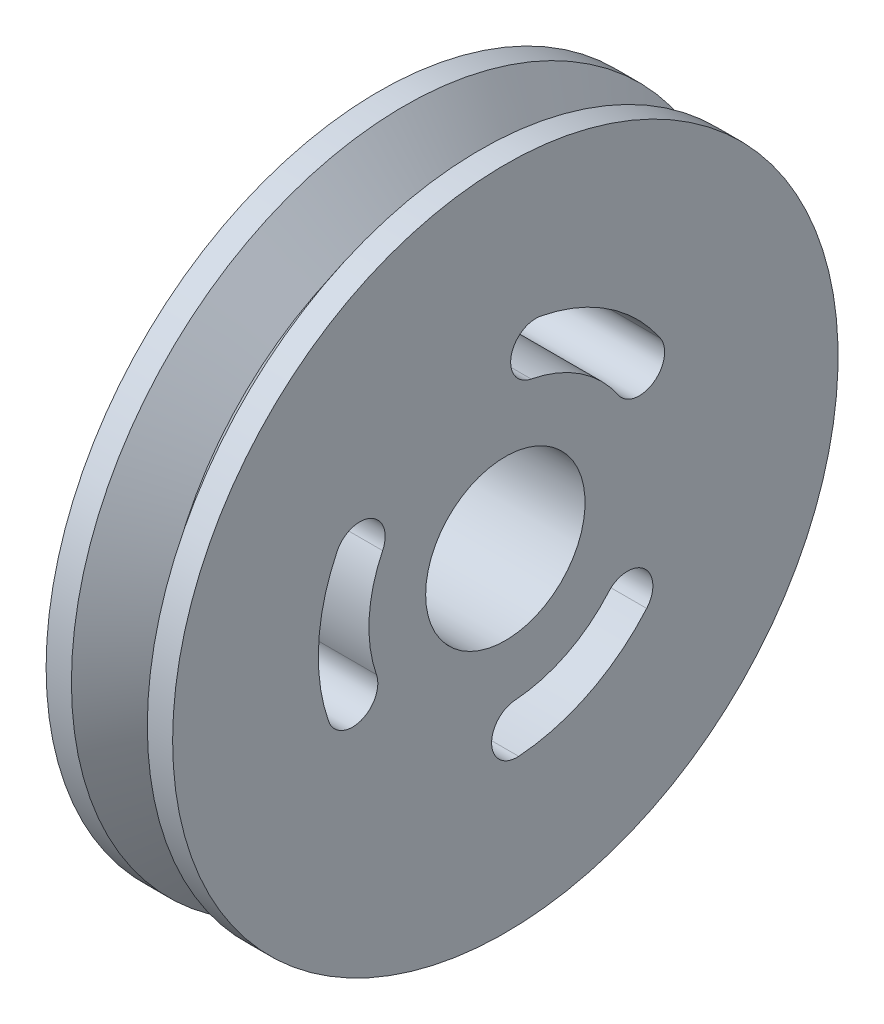
ISO-10303-21;
HEADER;
FILE_DESCRIPTION(('STEP AP214'),'2;1');
FILE_NAME('part.step','',(''),(''),'','','');
FILE_SCHEMA(('AUTOMOTIVE_DESIGN { 1 0 10303 214 1 1 1 1 }'));
ENDSEC;
DATA;
#1=APPLICATION_CONTEXT('core data for automotive mechanical design processes');
#2=APPLICATION_PROTOCOL_DEFINITION('international standard','automotive_design',2000,#1);
#3=PRODUCT_CONTEXT('',#1,'mechanical');
#4=PRODUCT('Part','Part','',(#3));
#5=PRODUCT_RELATED_PRODUCT_CATEGORY('part','',(#4));
#6=PRODUCT_DEFINITION_FORMATION('','',#4);
#7=PRODUCT_DEFINITION_CONTEXT('part definition',#1,'design');
#8=PRODUCT_DEFINITION('design','',#6,#7);
#9=PRODUCT_DEFINITION_SHAPE('','',#8);
#10=(LENGTH_UNIT() NAMED_UNIT(*) SI_UNIT(.MILLI.,.METRE.));
#11=(NAMED_UNIT(*) PLANE_ANGLE_UNIT() SI_UNIT($,.RADIAN.));
#12=(NAMED_UNIT(*) SI_UNIT($,.STERADIAN.) SOLID_ANGLE_UNIT());
#13=UNCERTAINTY_MEASURE_WITH_UNIT(LENGTH_MEASURE(1.E-05),#10,'distance_accuracy_value','');
#14=(GEOMETRIC_REPRESENTATION_CONTEXT(3) GLOBAL_UNCERTAINTY_ASSIGNED_CONTEXT((#13)) GLOBAL_UNIT_ASSIGNED_CONTEXT((#10,
#11,#12)) REPRESENTATION_CONTEXT('',''));
#15=CARTESIAN_POINT('',(0.,0.,0.));
#16=DIRECTION('',(0.,0.,1.));
#17=DIRECTION('',(1.,0.,0.));
#18=AXIS2_PLACEMENT_3D('',#15,#16,#17);
#19=CARTESIAN_POINT('',(0.,0.,0.));
#20=DIRECTION('',(-1.,0.,0.));
#21=DIRECTION('',(0.,0.,1.));
#22=AXIS2_PLACEMENT_3D('',#19,#20,#21);
#23=CYLINDRICAL_SURFACE('',#22,16.7);
#24=CARTESIAN_POINT('',(0.,0.,0.));
#25=DIRECTION('',(-1.,0.,0.));
#26=DIRECTION('',(0.,0.,1.));
#27=AXIS2_PLACEMENT_3D('',#24,#25,#26);
#28=CIRCLE('',#27,16.7);
#29=CARTESIAN_POINT('',(0.,0.,16.7));
#30=VERTEX_POINT('',#29);
#31=EDGE_CURVE('E11',#30,#30,#28,.T.);
#32=ORIENTED_EDGE('',*,*,#31,.F.);
#33=EDGE_LOOP('',(#32));
#34=FACE_BOUND('',#33,.T.);
#35=CARTESIAN_POINT('',(1.27,0.,0.));
#36=DIRECTION('',(-1.,0.,0.));
#37=DIRECTION('',(0.,0.,1.));
#38=AXIS2_PLACEMENT_3D('',#35,#36,#37);
#39=CIRCLE('',#38,16.7);
#40=CARTESIAN_POINT('',(1.27,0.,16.7));
#41=VERTEX_POINT('',#40);
#42=EDGE_CURVE('E239',#41,#41,#39,.T.);
#43=ORIENTED_EDGE('',*,*,#42,.T.);
#44=EDGE_LOOP('',(#43));
#45=FACE_BOUND('',#44,.T.);
#46=ADVANCED_FACE('F41',(#34,#45),#23,.T.);
#47=CARTESIAN_POINT('',(0.,4.,0.));
#48=DIRECTION('',(1.,0.,0.));
#49=DIRECTION('',(0.,0.,-1.));
#50=AXIS2_PLACEMENT_3D('',#47,#48,#49);
#51=PLANE('',#50);
#52=CARTESIAN_POINT('',(0.,-5.31594486441954,-6.13469558758409));
#53=DIRECTION('',(1.,0.,0.));
#54=DIRECTION('',(0.,0.,-1.));
#55=AXIS2_PLACEMENT_3D('',#52,#53,#54);
#56=CIRCLE('',#55,1.27);
#57=CARTESIAN_POINT('',(0.,-6.14763594661759,-7.09448199288072));
#58=VERTEX_POINT('',#57);
#59=CARTESIAN_POINT('',(0.,-4.48425378222147,-5.17490918228746));
#60=VERTEX_POINT('',#59);
#61=EDGE_CURVE('E230',#58,#60,#56,.T.);
#62=ORIENTED_EDGE('',*,*,#61,.T.);
#63=CARTESIAN_POINT('',(0.,-2.51914259051803E-10,-7.32369102869549E-10));
#64=DIRECTION('',(1.,0.,0.));
#65=DIRECTION('',(0.,0.,-1.));
#66=AXIS2_PLACEMENT_3D('',#63,#64,#65);
#67=CIRCLE('',#66,6.8474971355353);
#68=CARTESIAN_POINT('',(0.,-6.83005963277017,-0.488367116866568));
#69=VERTEX_POINT('',#68);
#70=EDGE_CURVE('E134',#60,#69,#67,.F.);
#71=ORIENTED_EDGE('',*,*,#70,.T.);
#72=CARTESIAN_POINT('',(0.,-8.09682551252071,-0.578944188467818));
#73=DIRECTION('',(1.,0.,0.));
#74=DIRECTION('',(0.,0.,-1.));
#75=AXIS2_PLACEMENT_3D('',#72,#73,#74);
#76=CIRCLE('',#75,1.27);
#77=CARTESIAN_POINT('',(0.,-9.36359139207367,-0.669521260054943));
#78=VERTEX_POINT('',#77);
#79=EDGE_CURVE('E235',#69,#78,#76,.T.);
#80=ORIENTED_EDGE('',*,*,#79,.T.);
#81=CARTESIAN_POINT('',(0.,-2.51914259051803E-10,-7.32369102869549E-10));
#82=DIRECTION('',(1.,0.,0.));
#83=DIRECTION('',(0.,0.,-1.));
#84=AXIS2_PLACEMENT_3D('',#81,#82,#83);
#85=CIRCLE('',#84,9.3874971355353);
#86=EDGE_CURVE('E232',#78,#58,#85,.T.);
#87=ORIENTED_EDGE('',*,*,#86,.T.);
#88=EDGE_LOOP('',(#62,#71,#80,#87));
#89=FACE_BOUND('',#88,.T.);
#90=CARTESIAN_POINT('',(0.,7.97077465452977,-1.53639550479309));
#91=DIRECTION('',(1.,0.,0.));
#92=DIRECTION('',(0.,0.,-1.));
#93=AXIS2_PLACEMENT_3D('',#90,#91,#92);
#94=CIRCLE('',#93,1.27);
#95=CARTESIAN_POINT('',(0.,9.21781960482263,-1.77676790742926));
#96=VERTEX_POINT('',#95);
#97=CARTESIAN_POINT('',(0.,6.72372970423691,-1.29602310215691));
#98=VERTEX_POINT('',#97);
#99=EDGE_CURVE('E218',#96,#98,#94,.T.);
#100=ORIENTED_EDGE('',*,*,#99,.T.);
#101=CARTESIAN_POINT('',(0.,-2.51914259051803E-10,-7.32369102869549E-10));
#102=DIRECTION('',(1.,0.,0.));
#103=DIRECTION('',(0.,0.,-1.));
#104=AXIS2_PLACEMENT_3D('',#101,#102,#103);
#105=CIRCLE('',#104,6.8474971355353);
#106=CARTESIAN_POINT('',(0.,3.83796814495237,-5.67082159378869));
#107=VERTEX_POINT('',#106);
#108=EDGE_CURVE('E227',#98,#107,#105,.F.);
#109=ORIENTED_EDGE('',*,*,#108,.T.);
#110=CARTESIAN_POINT('',(0.,4.54979312983473,-6.72258449049937));
#111=DIRECTION('',(1.,0.,0.));
#112=DIRECTION('',(0.,0.,-1.));
#113=AXIS2_PLACEMENT_3D('',#110,#111,#112);
#114=CIRCLE('',#113,1.27);
#115=CARTESIAN_POINT('',(0.,5.26161811460607,-7.77434738704602));
#116=VERTEX_POINT('',#115);
#117=EDGE_CURVE('E224',#107,#116,#114,.T.);
#118=ORIENTED_EDGE('',*,*,#117,.T.);
#119=CARTESIAN_POINT('',(0.,-2.51914259051803E-10,-7.32369102869549E-10));
#120=DIRECTION('',(1.,0.,0.));
#121=DIRECTION('',(0.,0.,-1.));
#122=AXIS2_PLACEMENT_3D('',#119,#120,#121);
#123=CIRCLE('',#122,9.38749713553531);
#124=EDGE_CURVE('E221',#116,#96,#123,.T.);
#125=ORIENTED_EDGE('',*,*,#124,.T.);
#126=EDGE_LOOP('',(#100,#109,#118,#125));
#127=FACE_BOUND('',#126,.T.);
#128=CARTESIAN_POINT('',(0.,-2.65482979086598,7.67109109018007));
#129=DIRECTION('',(1.,0.,0.));
#130=DIRECTION('',(0.,0.,-1.));
#131=AXIS2_PLACEMENT_3D('',#128,#129,#130);
#132=CIRCLE('',#131,1.27);
#133=CARTESIAN_POINT('',(0.,-3.07018365896078,8.87124989811287));
#134=VERTEX_POINT('',#133);
#135=CARTESIAN_POINT('',(0.,-2.23947592277117,6.47093228224726));
#136=VERTEX_POINT('',#135);
#137=EDGE_CURVE('E161',#134,#136,#132,.T.);
#138=ORIENTED_EDGE('',*,*,#137,.T.);
#139=CARTESIAN_POINT('',(0.,-2.51914259051803E-10,-7.32369102869549E-10));
#140=DIRECTION('',(1.,0.,0.));
#141=DIRECTION('',(0.,0.,-1.));
#142=AXIS2_PLACEMENT_3D('',#139,#140,#141);
#143=CIRCLE('',#142,6.8474971355353);
#144=CARTESIAN_POINT('',(0.,2.99209148706206,6.15918870845815));
#145=VERTEX_POINT('',#144);
#146=EDGE_CURVE('E215',#136,#145,#143,.F.);
#147=ORIENTED_EDGE('',*,*,#146,.T.);
#148=CARTESIAN_POINT('',(0.,3.54703238193023,7.30152867677008));
#149=DIRECTION('',(1.,0.,0.));
#150=DIRECTION('',(0.,0.,-1.));
#151=AXIS2_PLACEMENT_3D('',#148,#149,#150);
#152=CIRCLE('',#151,1.27);
#153=CARTESIAN_POINT('',(0.,4.10197327671187,8.44386864490385));
#154=VERTEX_POINT('',#153);
#155=EDGE_CURVE('E212',#145,#154,#152,.T.);
#156=ORIENTED_EDGE('',*,*,#155,.T.);
#157=CARTESIAN_POINT('',(0.,-2.51914259051803E-10,-7.32369102869549E-10));
#158=DIRECTION('',(1.,0.,0.));
#159=DIRECTION('',(0.,0.,-1.));
#160=AXIS2_PLACEMENT_3D('',#157,#158,#159);
#161=CIRCLE('',#160,9.3874971355353);
#162=EDGE_CURVE('E209',#154,#134,#161,.T.);
#163=ORIENTED_EDGE('',*,*,#162,.T.);
#164=EDGE_LOOP('',(#138,#147,#156,#163));
#165=FACE_BOUND('',#164,.T.);
#166=CARTESIAN_POINT('',(0.,0.,0.));
#167=DIRECTION('',(-1.,0.,0.));
#168=DIRECTION('',(0.,0.,1.));
#169=AXIS2_PLACEMENT_3D('',#166,#167,#168);
#170=CIRCLE('',#169,4.);
#171=CARTESIAN_POINT('',(0.,0.,4.));
#172=VERTEX_POINT('',#171);
#173=EDGE_CURVE('E48',#172,#172,#170,.T.);
#174=ORIENTED_EDGE('',*,*,#173,.F.);
#175=EDGE_LOOP('',(#174));
#176=FACE_BOUND('',#175,.T.);
#177=ORIENTED_EDGE('',*,*,#31,.T.);
#178=EDGE_LOOP('',(#177));
#179=FACE_BOUND('',#178,.T.);
#180=ADVANCED_FACE('F258',(#89,#127,#165,#176,#179),#51,.F.);
#181=CARTESIAN_POINT('',(0.,0.,0.));
#182=DIRECTION('',(-1.,0.,0.));
#183=DIRECTION('',(0.,0.,1.));
#184=AXIS2_PLACEMENT_3D('',#181,#182,#183);
#185=CYLINDRICAL_SURFACE('',#184,4.);
#186=CARTESIAN_POINT('',(6.35,0.,0.));
#187=DIRECTION('',(-1.,0.,0.));
#188=DIRECTION('',(0.,0.,1.));
#189=AXIS2_PLACEMENT_3D('',#186,#187,#188);
#190=CIRCLE('',#189,4.);
#191=CARTESIAN_POINT('',(6.35,0.,4.));
#192=VERTEX_POINT('',#191);
#193=EDGE_CURVE('E251',#192,#192,#190,.T.);
#194=ORIENTED_EDGE('',*,*,#193,.F.);
#195=EDGE_LOOP('',(#194));
#196=FACE_BOUND('',#195,.T.);
#197=ORIENTED_EDGE('',*,*,#173,.T.);
#198=EDGE_LOOP('',(#197));
#199=FACE_BOUND('',#198,.T.);
#200=ADVANCED_FACE('F256',(#196,#199),#185,.F.);
#201=CARTESIAN_POINT('',(6.35,4.,0.));
#202=DIRECTION('',(-1.,0.,0.));
#203=DIRECTION('',(0.,0.,1.));
#204=AXIS2_PLACEMENT_3D('',#201,#202,#203);
#205=PLANE('',#204);
#206=CARTESIAN_POINT('',(6.35,-8.09682551252071,-0.578944188467818));
#207=DIRECTION('',(-1.,0.,0.));
#208=DIRECTION('',(0.,0.,1.));
#209=AXIS2_PLACEMENT_3D('',#206,#207,#208);
#210=CIRCLE('',#209,1.27);
#211=CARTESIAN_POINT('',(6.35,-9.36359139207367,-0.669521260054943));
#212=VERTEX_POINT('',#211);
#213=CARTESIAN_POINT('',(6.35,-6.83005963277017,-0.488367116866568));
#214=VERTEX_POINT('',#213);
#215=EDGE_CURVE('E137',#212,#214,#210,.T.);
#216=ORIENTED_EDGE('',*,*,#215,.T.);
#217=CARTESIAN_POINT('',(6.35,-2.51914259051803E-10,-7.32369102869549E-10));
#218=DIRECTION('',(1.,0.,0.));
#219=DIRECTION('',(0.,0.,1.));
#220=AXIS2_PLACEMENT_3D('',#217,#218,#219);
#221=CIRCLE('',#220,6.8474971355353);
#222=CARTESIAN_POINT('',(6.35,-4.48425378222147,-5.17490918228746));
#223=VERTEX_POINT('',#222);
#224=EDGE_CURVE('E131',#214,#223,#221,.T.);
#225=ORIENTED_EDGE('',*,*,#224,.T.);
#226=CARTESIAN_POINT('',(6.35,-5.31594486441954,-6.13469558758409));
#227=DIRECTION('',(-1.,0.,0.));
#228=DIRECTION('',(0.,0.,1.));
#229=AXIS2_PLACEMENT_3D('',#226,#227,#228);
#230=CIRCLE('',#229,1.27);
#231=CARTESIAN_POINT('',(6.35,-6.14763594661759,-7.09448199288072));
#232=VERTEX_POINT('',#231);
#233=EDGE_CURVE('E141',#223,#232,#230,.T.);
#234=ORIENTED_EDGE('',*,*,#233,.T.);
#235=CARTESIAN_POINT('',(6.35,-2.51914259051803E-10,-7.32369102869549E-10));
#236=DIRECTION('',(-1.,0.,0.));
#237=DIRECTION('',(0.,0.,1.));
#238=AXIS2_PLACEMENT_3D('',#235,#236,#237);
#239=CIRCLE('',#238,9.3874971355353);
#240=EDGE_CURVE('E146',#232,#212,#239,.T.);
#241=ORIENTED_EDGE('',*,*,#240,.T.);
#242=EDGE_LOOP('',(#216,#225,#234,#241));
#243=FACE_BOUND('',#242,.T.);
#244=CARTESIAN_POINT('',(6.35,4.54979312983473,-6.72258449049937));
#245=DIRECTION('',(-1.,0.,0.));
#246=DIRECTION('',(0.,0.,1.));
#247=AXIS2_PLACEMENT_3D('',#244,#245,#246);
#248=CIRCLE('',#247,1.27);
#249=CARTESIAN_POINT('',(6.35,5.26161811460607,-7.77434738704602));
#250=VERTEX_POINT('',#249);
#251=CARTESIAN_POINT('',(6.35,3.83796814495237,-5.67082159378869));
#252=VERTEX_POINT('',#251);
#253=EDGE_CURVE('E167',#250,#252,#248,.T.);
#254=ORIENTED_EDGE('',*,*,#253,.T.);
#255=CARTESIAN_POINT('',(6.35,-2.51914259051803E-10,-7.32369102869549E-10));
#256=DIRECTION('',(1.,0.,0.));
#257=DIRECTION('',(0.,0.,1.));
#258=AXIS2_PLACEMENT_3D('',#255,#256,#257);
#259=CIRCLE('',#258,6.8474971355353);
#260=CARTESIAN_POINT('',(6.35,6.72372970423691,-1.29602310215691));
#261=VERTEX_POINT('',#260);
#262=EDGE_CURVE('E151',#252,#261,#259,.T.);
#263=ORIENTED_EDGE('',*,*,#262,.T.);
#264=CARTESIAN_POINT('',(6.35,7.97077465452977,-1.53639550479309));
#265=DIRECTION('',(-1.,0.,0.));
#266=DIRECTION('',(0.,0.,1.));
#267=AXIS2_PLACEMENT_3D('',#264,#265,#266);
#268=CIRCLE('',#267,1.27);
#269=CARTESIAN_POINT('',(6.35,9.21781960482263,-1.77676790742926));
#270=VERTEX_POINT('',#269);
#271=EDGE_CURVE('E154',#261,#270,#268,.T.);
#272=ORIENTED_EDGE('',*,*,#271,.T.);
#273=CARTESIAN_POINT('',(6.35,-2.51914259051803E-10,-7.32369102869549E-10));
#274=DIRECTION('',(-1.,0.,0.));
#275=DIRECTION('',(0.,0.,1.));
#276=AXIS2_PLACEMENT_3D('',#273,#274,#275);
#277=CIRCLE('',#276,9.38749713553531);
#278=EDGE_CURVE('E180',#270,#250,#277,.T.);
#279=ORIENTED_EDGE('',*,*,#278,.T.);
#280=EDGE_LOOP('',(#254,#263,#272,#279));
#281=FACE_BOUND('',#280,.T.);
#282=CARTESIAN_POINT('',(6.35,3.54703238193023,7.30152867677008));
#283=DIRECTION('',(-1.,0.,0.));
#284=DIRECTION('',(0.,0.,1.));
#285=AXIS2_PLACEMENT_3D('',#282,#283,#284);
#286=CIRCLE('',#285,1.27);
#287=CARTESIAN_POINT('',(6.35,4.10197327671187,8.44386864490385));
#288=VERTEX_POINT('',#287);
#289=CARTESIAN_POINT('',(6.35,2.99209148706206,6.15918870845815));
#290=VERTEX_POINT('',#289);
#291=EDGE_CURVE('E187',#288,#290,#286,.T.);
#292=ORIENTED_EDGE('',*,*,#291,.T.);
#293=CARTESIAN_POINT('',(6.35,-2.51914259051803E-10,-7.32369102869549E-10));
#294=DIRECTION('',(1.,0.,0.));
#295=DIRECTION('',(0.,0.,1.));
#296=AXIS2_PLACEMENT_3D('',#293,#294,#295);
#297=CIRCLE('',#296,6.8474971355353);
#298=CARTESIAN_POINT('',(6.35,-2.23947592277117,6.47093228224726));
#299=VERTEX_POINT('',#298);
#300=EDGE_CURVE('E177',#290,#299,#297,.T.);
#301=ORIENTED_EDGE('',*,*,#300,.T.);
#302=CARTESIAN_POINT('',(6.35,-2.65482979086598,7.67109109018007));
#303=DIRECTION('',(-1.,0.,0.));
#304=DIRECTION('',(0.,0.,1.));
#305=AXIS2_PLACEMENT_3D('',#302,#303,#304);
#306=CIRCLE('',#305,1.27);
#307=CARTESIAN_POINT('',(6.35,-3.07018365896078,8.87124989811287));
#308=VERTEX_POINT('',#307);
#309=EDGE_CURVE('E202',#299,#308,#306,.T.);
#310=ORIENTED_EDGE('',*,*,#309,.T.);
#311=CARTESIAN_POINT('',(6.35,-2.51914259051803E-10,-7.32369102869549E-10));
#312=DIRECTION('',(-1.,0.,0.));
#313=DIRECTION('',(0.,0.,1.));
#314=AXIS2_PLACEMENT_3D('',#311,#312,#313);
#315=CIRCLE('',#314,9.3874971355353);
#316=EDGE_CURVE('E199',#308,#288,#315,.T.);
#317=ORIENTED_EDGE('',*,*,#316,.T.);
#318=EDGE_LOOP('',(#292,#301,#310,#317));
#319=FACE_BOUND('',#318,.T.);
#320=CARTESIAN_POINT('',(6.35,0.,0.));
#321=DIRECTION('',(-1.,0.,0.));
#322=DIRECTION('',(0.,0.,1.));
#323=AXIS2_PLACEMENT_3D('',#320,#321,#322);
#324=CIRCLE('',#323,16.7);
#325=CARTESIAN_POINT('',(6.35,0.,16.7));
#326=VERTEX_POINT('',#325);
#327=EDGE_CURVE('E248',#326,#326,#324,.T.);
#328=ORIENTED_EDGE('',*,*,#327,.F.);
#329=EDGE_LOOP('',(#328));
#330=FACE_BOUND('',#329,.T.);
#331=ORIENTED_EDGE('',*,*,#193,.T.);
#332=EDGE_LOOP('',(#331));
#333=FACE_BOUND('',#332,.T.);
#334=ADVANCED_FACE('F148',(#243,#281,#319,#330,#333),#205,.F.);
#335=CARTESIAN_POINT('',(0.,0.,0.));
#336=DIRECTION('',(-1.,0.,0.));
#337=DIRECTION('',(0.,0.,1.));
#338=AXIS2_PLACEMENT_3D('',#335,#336,#337);
#339=CYLINDRICAL_SURFACE('',#338,16.7);
#340=CARTESIAN_POINT('',(5.08,0.,0.));
#341=DIRECTION('',(-1.,0.,0.));
#342=DIRECTION('',(0.,0.,1.));
#343=AXIS2_PLACEMENT_3D('',#340,#341,#342);
#344=CIRCLE('',#343,16.7);
#345=CARTESIAN_POINT('',(5.08,0.,16.7));
#346=VERTEX_POINT('',#345);
#347=EDGE_CURVE('E245',#346,#346,#344,.T.);
#348=ORIENTED_EDGE('',*,*,#347,.F.);
#349=EDGE_LOOP('',(#348));
#350=FACE_BOUND('',#349,.T.);
#351=ORIENTED_EDGE('',*,*,#327,.T.);
#352=EDGE_LOOP('',(#351));
#353=FACE_BOUND('',#352,.T.);
#354=ADVANCED_FACE('F278',(#350,#353),#339,.T.);
#355=CARTESIAN_POINT('',(5.08,0.,0.));
#356=DIRECTION('',(1.,0.,0.));
#357=DIRECTION('',(0.,0.,-1.));
#358=AXIS2_PLACEMENT_3D('',#355,#356,#357);
#359=CONICAL_SURFACE('',#358,16.7,0.927295218001613);
#360=CARTESIAN_POINT('',(3.175,0.,0.));
#361=DIRECTION('',(-1.,0.,0.));
#362=DIRECTION('',(0.,0.,1.));
#363=AXIS2_PLACEMENT_3D('',#360,#361,#362);
#364=CIRCLE('',#363,14.16);
#365=CARTESIAN_POINT('',(3.175,0.,14.16));
#366=VERTEX_POINT('',#365);
#367=EDGE_CURVE('E242',#366,#366,#364,.T.);
#368=ORIENTED_EDGE('',*,*,#367,.F.);
#369=EDGE_LOOP('',(#368));
#370=FACE_BOUND('',#369,.T.);
#371=ORIENTED_EDGE('',*,*,#347,.T.);
#372=EDGE_LOOP('',(#371));
#373=FACE_BOUND('',#372,.T.);
#374=ADVANCED_FACE('F272',(#370,#373),#359,.T.);
#375=CARTESIAN_POINT('',(3.175,0.,0.));
#376=DIRECTION('',(-1.,0.,0.));
#377=DIRECTION('',(0.,0.,1.));
#378=AXIS2_PLACEMENT_3D('',#375,#376,#377);
#379=CONICAL_SURFACE('',#378,14.16,0.927295218001613);
#380=ORIENTED_EDGE('',*,*,#42,.F.);
#381=EDGE_LOOP('',(#380));
#382=FACE_BOUND('',#381,.T.);
#383=ORIENTED_EDGE('',*,*,#367,.T.);
#384=EDGE_LOOP('',(#383));
#385=FACE_BOUND('',#384,.T.);
#386=ADVANCED_FACE('F268',(#382,#385),#379,.T.);
#387=CARTESIAN_POINT('',(6.35,-2.51914259051803E-10,-7.32369102869549E-10));
#388=DIRECTION('',(-1.,0.,0.));
#389=DIRECTION('',(0.,0.,1.));
#390=AXIS2_PLACEMENT_3D('',#387,#388,#389);
#391=CYLINDRICAL_SURFACE('',#390,6.8474971355353);
#392=DIRECTION('',(-1.,0.,0.));
#393=VECTOR('',#392,1.);
#394=CARTESIAN_POINT('',(6.35,-2.23947592277117,6.47093228224726));
#395=LINE('',#394,#393);
#396=EDGE_CURVE('E185',#299,#136,#395,.T.);
#397=ORIENTED_EDGE('',*,*,#396,.F.);
#398=ORIENTED_EDGE('',*,*,#300,.F.);
#399=DIRECTION('',(-1.,0.,0.));
#400=VECTOR('',#399,1.);
#401=CARTESIAN_POINT('',(6.35,2.99209148706206,6.15918870845815));
#402=LINE('',#401,#400);
#403=EDGE_CURVE('E194',#290,#145,#402,.T.);
#404=ORIENTED_EDGE('',*,*,#403,.T.);
#405=ORIENTED_EDGE('',*,*,#146,.F.);
#406=EDGE_LOOP('',(#397,#398,#404,#405));
#407=FACE_BOUND('',#406,.T.);
#408=ADVANCED_FACE('F271',(#407),#391,.T.);
#409=CARTESIAN_POINT('',(6.35,3.54703238193023,7.30152867677008));
#410=DIRECTION('',(-1.,0.,0.));
#411=DIRECTION('',(0.,0.,1.));
#412=AXIS2_PLACEMENT_3D('',#409,#410,#411);
#413=CYLINDRICAL_SURFACE('',#412,1.27);
#414=ORIENTED_EDGE('',*,*,#403,.F.);
#415=ORIENTED_EDGE('',*,*,#291,.F.);
#416=DIRECTION('',(-1.,0.,0.));
#417=VECTOR('',#416,1.);
#418=CARTESIAN_POINT('',(6.35,4.10197327671187,8.44386864490385));
#419=LINE('',#418,#417);
#420=EDGE_CURVE('E191',#288,#154,#419,.T.);
#421=ORIENTED_EDGE('',*,*,#420,.T.);
#422=ORIENTED_EDGE('',*,*,#155,.F.);
#423=EDGE_LOOP('',(#414,#415,#421,#422));
#424=FACE_BOUND('',#423,.T.);
#425=ADVANCED_FACE('F297',(#424),#413,.F.);
#426=CARTESIAN_POINT('',(6.35,-2.51914259051803E-10,-7.32369102869549E-10));
#427=DIRECTION('',(-1.,0.,0.));
#428=DIRECTION('',(0.,0.,1.));
#429=AXIS2_PLACEMENT_3D('',#426,#427,#428);
#430=CYLINDRICAL_SURFACE('',#429,9.3874971355353);
#431=ORIENTED_EDGE('',*,*,#420,.F.);
#432=ORIENTED_EDGE('',*,*,#316,.F.);
#433=DIRECTION('',(-1.,0.,0.));
#434=VECTOR('',#433,1.);
#435=CARTESIAN_POINT('',(6.35,-3.07018365896078,8.87124989811287));
#436=LINE('',#435,#434);
#437=EDGE_CURVE('E188',#308,#134,#436,.T.);
#438=ORIENTED_EDGE('',*,*,#437,.T.);
#439=ORIENTED_EDGE('',*,*,#162,.F.);
#440=EDGE_LOOP('',(#431,#432,#438,#439));
#441=FACE_BOUND('',#440,.T.);
#442=ADVANCED_FACE('F300',(#441),#430,.F.);
#443=CARTESIAN_POINT('',(6.35,-2.65482979086598,7.67109109018007));
#444=DIRECTION('',(-1.,0.,0.));
#445=DIRECTION('',(0.,0.,1.));
#446=AXIS2_PLACEMENT_3D('',#443,#444,#445);
#447=CYLINDRICAL_SURFACE('',#446,1.27);
#448=ORIENTED_EDGE('',*,*,#437,.F.);
#449=ORIENTED_EDGE('',*,*,#309,.F.);
#450=ORIENTED_EDGE('',*,*,#396,.T.);
#451=ORIENTED_EDGE('',*,*,#137,.F.);
#452=EDGE_LOOP('',(#448,#449,#450,#451));
#453=FACE_BOUND('',#452,.T.);
#454=ADVANCED_FACE('F304',(#453),#447,.F.);
#455=CARTESIAN_POINT('',(6.35,-2.51914259051803E-10,-7.32369102869549E-10));
#456=DIRECTION('',(-1.,0.,0.));
#457=DIRECTION('',(0.,0.,1.));
#458=AXIS2_PLACEMENT_3D('',#455,#456,#457);
#459=CYLINDRICAL_SURFACE('',#458,6.8474971355353);
#460=DIRECTION('',(-1.,0.,0.));
#461=VECTOR('',#460,1.);
#462=CARTESIAN_POINT('',(6.35,6.72372970423691,-1.29602310215691));
#463=LINE('',#462,#461);
#464=EDGE_CURVE('E63',#261,#98,#463,.T.);
#465=ORIENTED_EDGE('',*,*,#464,.F.);
#466=ORIENTED_EDGE('',*,*,#262,.F.);
#467=DIRECTION('',(-1.,0.,0.));
#468=VECTOR('',#467,1.);
#469=CARTESIAN_POINT('',(6.35,3.83796814495237,-5.67082159378869));
#470=LINE('',#469,#468);
#471=EDGE_CURVE('E174',#252,#107,#470,.T.);
#472=ORIENTED_EDGE('',*,*,#471,.T.);
#473=ORIENTED_EDGE('',*,*,#108,.F.);
#474=EDGE_LOOP('',(#465,#466,#472,#473));
#475=FACE_BOUND('',#474,.T.);
#476=ADVANCED_FACE('F308',(#475),#459,.T.);
#477=CARTESIAN_POINT('',(6.35,4.54979312983473,-6.72258449049937));
#478=DIRECTION('',(-1.,0.,0.));
#479=DIRECTION('',(0.,0.,1.));
#480=AXIS2_PLACEMENT_3D('',#477,#478,#479);
#481=CYLINDRICAL_SURFACE('',#480,1.27);
#482=ORIENTED_EDGE('',*,*,#471,.F.);
#483=ORIENTED_EDGE('',*,*,#253,.F.);
#484=DIRECTION('',(-1.,0.,0.));
#485=VECTOR('',#484,1.);
#486=CARTESIAN_POINT('',(6.35,5.26161811460607,-7.77434738704602));
#487=LINE('',#486,#485);
#488=EDGE_CURVE('E171',#250,#116,#487,.T.);
#489=ORIENTED_EDGE('',*,*,#488,.T.);
#490=ORIENTED_EDGE('',*,*,#117,.F.);
#491=EDGE_LOOP('',(#482,#483,#489,#490));
#492=FACE_BOUND('',#491,.T.);
#493=ADVANCED_FACE('F313',(#492),#481,.F.);
#494=CARTESIAN_POINT('',(6.35,-2.51914259051803E-10,-7.32369102869549E-10));
#495=DIRECTION('',(-1.,0.,0.));
#496=DIRECTION('',(0.,0.,1.));
#497=AXIS2_PLACEMENT_3D('',#494,#495,#496);
#498=CYLINDRICAL_SURFACE('',#497,9.38749713553531);
#499=ORIENTED_EDGE('',*,*,#488,.F.);
#500=ORIENTED_EDGE('',*,*,#278,.F.);
#501=DIRECTION('',(-1.,0.,0.));
#502=VECTOR('',#501,1.);
#503=CARTESIAN_POINT('',(6.35,9.21781960482263,-1.77676790742926));
#504=LINE('',#503,#502);
#505=EDGE_CURVE('E168',#270,#96,#504,.T.);
#506=ORIENTED_EDGE('',*,*,#505,.T.);
#507=ORIENTED_EDGE('',*,*,#124,.F.);
#508=EDGE_LOOP('',(#499,#500,#506,#507));
#509=FACE_BOUND('',#508,.T.);
#510=ADVANCED_FACE('F316',(#509),#498,.F.);
#511=CARTESIAN_POINT('',(6.35,7.97077465452977,-1.53639550479309));
#512=DIRECTION('',(-1.,0.,0.));
#513=DIRECTION('',(0.,0.,1.));
#514=AXIS2_PLACEMENT_3D('',#511,#512,#513);
#515=CYLINDRICAL_SURFACE('',#514,1.27);
#516=ORIENTED_EDGE('',*,*,#505,.F.);
#517=ORIENTED_EDGE('',*,*,#271,.F.);
#518=ORIENTED_EDGE('',*,*,#464,.T.);
#519=ORIENTED_EDGE('',*,*,#99,.F.);
#520=EDGE_LOOP('',(#516,#517,#518,#519));
#521=FACE_BOUND('',#520,.T.);
#522=ADVANCED_FACE('F320',(#521),#515,.F.);
#523=CARTESIAN_POINT('',(6.35,-2.51914259051803E-10,-7.32369102869549E-10));
#524=DIRECTION('',(-1.,0.,0.));
#525=DIRECTION('',(0.,0.,1.));
#526=AXIS2_PLACEMENT_3D('',#523,#524,#525);
#527=CYLINDRICAL_SURFACE('',#526,6.8474971355353);
#528=DIRECTION('',(-1.,0.,0.));
#529=VECTOR('',#528,1.);
#530=CARTESIAN_POINT('',(6.35,-4.48425378222147,-5.17490918228746));
#531=LINE('',#530,#529);
#532=EDGE_CURVE('E55',#223,#60,#531,.T.);
#533=ORIENTED_EDGE('',*,*,#532,.F.);
#534=ORIENTED_EDGE('',*,*,#224,.F.);
#535=DIRECTION('',(-1.,0.,0.));
#536=VECTOR('',#535,1.);
#537=CARTESIAN_POINT('',(6.35,-6.83005963277017,-0.488367116866568));
#538=LINE('',#537,#536);
#539=EDGE_CURVE('E159',#214,#69,#538,.T.);
#540=ORIENTED_EDGE('',*,*,#539,.T.);
#541=ORIENTED_EDGE('',*,*,#70,.F.);
#542=EDGE_LOOP('',(#533,#534,#540,#541));
#543=FACE_BOUND('',#542,.T.);
#544=ADVANCED_FACE('F128',(#543),#527,.T.);
#545=CARTESIAN_POINT('',(6.35,-8.09682551252071,-0.578944188467818));
#546=DIRECTION('',(-1.,0.,0.));
#547=DIRECTION('',(0.,0.,1.));
#548=AXIS2_PLACEMENT_3D('',#545,#546,#547);
#549=CYLINDRICAL_SURFACE('',#548,1.27);
#550=ORIENTED_EDGE('',*,*,#539,.F.);
#551=ORIENTED_EDGE('',*,*,#215,.F.);
#552=DIRECTION('',(-1.,0.,0.));
#553=VECTOR('',#552,1.);
#554=CARTESIAN_POINT('',(6.35,-9.36359139207367,-0.669521260054943));
#555=LINE('',#554,#553);
#556=EDGE_CURVE('E162',#212,#78,#555,.T.);
#557=ORIENTED_EDGE('',*,*,#556,.T.);
#558=ORIENTED_EDGE('',*,*,#79,.F.);
#559=EDGE_LOOP('',(#550,#551,#557,#558));
#560=FACE_BOUND('',#559,.T.);
#561=ADVANCED_FACE('F329',(#560),#549,.F.);
#562=CARTESIAN_POINT('',(6.35,-2.51914259051803E-10,-7.32369102869549E-10));
#563=DIRECTION('',(-1.,0.,0.));
#564=DIRECTION('',(0.,0.,1.));
#565=AXIS2_PLACEMENT_3D('',#562,#563,#564);
#566=CYLINDRICAL_SURFACE('',#565,9.3874971355353);
#567=ORIENTED_EDGE('',*,*,#556,.F.);
#568=ORIENTED_EDGE('',*,*,#240,.F.);
#569=DIRECTION('',(-1.,0.,0.));
#570=VECTOR('',#569,1.);
#571=CARTESIAN_POINT('',(6.35,-6.14763594661759,-7.09448199288072));
#572=LINE('',#571,#570);
#573=EDGE_CURVE('E136',#232,#58,#572,.T.);
#574=ORIENTED_EDGE('',*,*,#573,.T.);
#575=ORIENTED_EDGE('',*,*,#86,.F.);
#576=EDGE_LOOP('',(#567,#568,#574,#575));
#577=FACE_BOUND('',#576,.T.);
#578=ADVANCED_FACE('F332',(#577),#566,.F.);
#579=CARTESIAN_POINT('',(6.35,-5.31594486441954,-6.13469558758409));
#580=DIRECTION('',(-1.,0.,0.));
#581=DIRECTION('',(0.,0.,1.));
#582=AXIS2_PLACEMENT_3D('',#579,#580,#581);
#583=CYLINDRICAL_SURFACE('',#582,1.27);
#584=ORIENTED_EDGE('',*,*,#573,.F.);
#585=ORIENTED_EDGE('',*,*,#233,.F.);
#586=ORIENTED_EDGE('',*,*,#532,.T.);
#587=ORIENTED_EDGE('',*,*,#61,.F.);
#588=EDGE_LOOP('',(#584,#585,#586,#587));
#589=FACE_BOUND('',#588,.T.);
#590=ADVANCED_FACE('F142',(#589),#583,.F.);
#591=CLOSED_SHELL('',(#46,#180,#200,#334,#354,#374,#386,#408,#425,#442,#454,#476,#493,#510,#522,
#544,#561,#578,#590));
#592=MANIFOLD_SOLID_BREP('B2',#591);
#593=ADVANCED_BREP_SHAPE_REPRESENTATION('',(#18,#592),#14);
#594=SHAPE_DEFINITION_REPRESENTATION(#9,#593);
ENDSEC;
END-ISO-10303-21;
